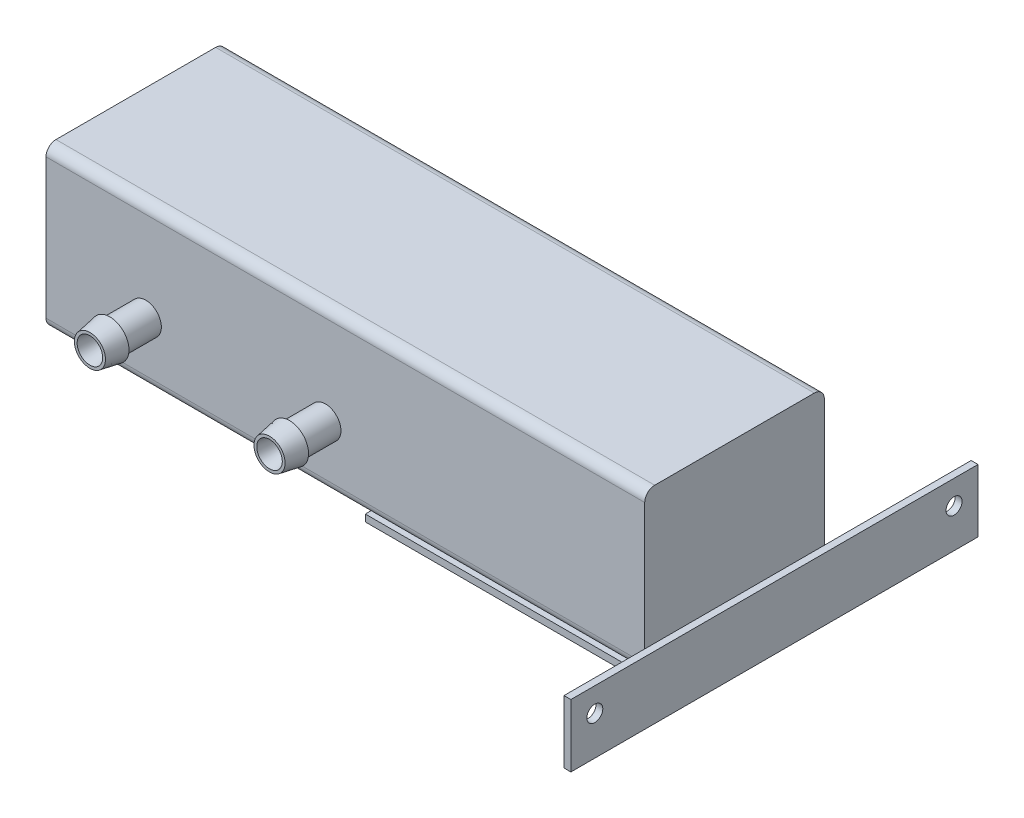
ISO-10303-21;
HEADER;
FILE_DESCRIPTION(('STEP AP214'),'2;1');
FILE_NAME('part.step','',(''),(''),'','','');
FILE_SCHEMA(('AUTOMOTIVE_DESIGN { 1 0 10303 214 1 1 1 1 }'));
ENDSEC;
DATA;
#1=APPLICATION_CONTEXT('core data for automotive mechanical design processes');
#2=APPLICATION_PROTOCOL_DEFINITION('international standard','automotive_design',2000,#1);
#3=PRODUCT_CONTEXT('',#1,'mechanical');
#4=PRODUCT('Part','Part','',(#3));
#5=PRODUCT_RELATED_PRODUCT_CATEGORY('part','',(#4));
#6=PRODUCT_DEFINITION_FORMATION('','',#4);
#7=PRODUCT_DEFINITION_CONTEXT('part definition',#1,'design');
#8=PRODUCT_DEFINITION('design','',#6,#7);
#9=PRODUCT_DEFINITION_SHAPE('','',#8);
#10=(LENGTH_UNIT() NAMED_UNIT(*) SI_UNIT(.MILLI.,.METRE.));
#11=(NAMED_UNIT(*) PLANE_ANGLE_UNIT() SI_UNIT($,.RADIAN.));
#12=(NAMED_UNIT(*) SI_UNIT($,.STERADIAN.) SOLID_ANGLE_UNIT());
#13=UNCERTAINTY_MEASURE_WITH_UNIT(LENGTH_MEASURE(1.E-05),#10,'distance_accuracy_value','');
#14=(GEOMETRIC_REPRESENTATION_CONTEXT(3) GLOBAL_UNCERTAINTY_ASSIGNED_CONTEXT((#13)) GLOBAL_UNIT_ASSIGNED_CONTEXT((#10,
#11,#12)) REPRESENTATION_CONTEXT('',''));
#15=CARTESIAN_POINT('',(0.,0.,0.));
#16=DIRECTION('',(0.,0.,1.));
#17=DIRECTION('',(1.,0.,0.));
#18=AXIS2_PLACEMENT_3D('',#15,#16,#17);
#19=CARTESIAN_POINT('',(0.,0.,28.575));
#20=DIRECTION('',(0.,0.,1.));
#21=DIRECTION('',(1.,0.,0.));
#22=AXIS2_PLACEMENT_3D('',#19,#20,#21);
#23=PLANE('',#22);
#24=DIRECTION('',(1.,0.,0.));
#25=VECTOR('',#24,1.);
#26=CARTESIAN_POINT('',(6.35000000000001,-27.5886003167765,28.575));
#27=LINE('',#26,#25);
#28=CARTESIAN_POINT('',(6.35000000000001,-27.5886003167765,28.575));
#29=VERTEX_POINT('',#28);
#30=CARTESIAN_POINT('',(105.761399683223,-27.5886003167765,28.575));
#31=VERTEX_POINT('',#30);
#32=EDGE_CURVE('E64',#29,#31,#27,.T.);
#33=ORIENTED_EDGE('',*,*,#32,.T.);
#34=DIRECTION('',(0.,1.,0.));
#35=VECTOR('',#34,1.);
#36=CARTESIAN_POINT('',(105.761399683223,0.,28.575));
#37=LINE('',#36,#35);
#38=CARTESIAN_POINT('',(105.761399683223,-25.4,28.575));
#39=VERTEX_POINT('',#38);
#40=EDGE_CURVE('E161',#31,#39,#37,.T.);
#41=ORIENTED_EDGE('',*,*,#40,.T.);
#42=DIRECTION('',(-1.,0.,0.));
#43=VECTOR('',#42,1.);
#44=CARTESIAN_POINT('',(6.35000000000001,-25.4,28.575));
#45=LINE('',#44,#43);
#46=CARTESIAN_POINT('',(6.35000000000001,-25.4,28.575));
#47=VERTEX_POINT('',#46);
#48=EDGE_CURVE('E170',#39,#47,#45,.T.);
#49=ORIENTED_EDGE('',*,*,#48,.T.);
#50=DIRECTION('',(0.,-1.,0.));
#51=VECTOR('',#50,1.);
#52=CARTESIAN_POINT('',(6.35000000000001,-25.4,28.575));
#53=LINE('',#52,#51);
#54=EDGE_CURVE('E163',#47,#29,#53,.T.);
#55=ORIENTED_EDGE('',*,*,#54,.T.);
#56=EDGE_LOOP('',(#33,#41,#49,#55));
#57=FACE_BOUND('',#56,.T.);
#58=ADVANCED_FACE('F49',(#57),#23,.T.);
#59=CARTESIAN_POINT('',(0.,0.,-28.575));
#60=DIRECTION('',(0.,0.,1.));
#61=DIRECTION('',(1.,0.,0.));
#62=AXIS2_PLACEMENT_3D('',#59,#60,#61);
#63=PLANE('',#62);
#64=DIRECTION('',(0.,1.,0.));
#65=VECTOR('',#64,1.);
#66=CARTESIAN_POINT('',(105.761399683223,0.,-28.575));
#67=LINE('',#66,#65);
#68=CARTESIAN_POINT('',(105.761399683223,-27.5886003167765,-28.575));
#69=VERTEX_POINT('',#68);
#70=CARTESIAN_POINT('',(105.761399683223,-25.4,-28.575));
#71=VERTEX_POINT('',#70);
#72=EDGE_CURVE('E12',#69,#71,#67,.T.);
#73=ORIENTED_EDGE('',*,*,#72,.F.);
#74=DIRECTION('',(-1.,0.,0.));
#75=VECTOR('',#74,1.);
#76=CARTESIAN_POINT('',(6.35000000000001,-27.5886003167765,-28.575));
#77=LINE('',#76,#75);
#78=CARTESIAN_POINT('',(6.35000000000001,-27.5886003167765,-28.575));
#79=VERTEX_POINT('',#78);
#80=EDGE_CURVE('E57',#69,#79,#77,.T.);
#81=ORIENTED_EDGE('',*,*,#80,.T.);
#82=DIRECTION('',(0.,1.,0.));
#83=VECTOR('',#82,1.);
#84=CARTESIAN_POINT('',(6.35000000000001,-25.4,-28.575));
#85=LINE('',#84,#83);
#86=CARTESIAN_POINT('',(6.35000000000001,-25.4,-28.575));
#87=VERTEX_POINT('',#86);
#88=EDGE_CURVE('E165',#79,#87,#85,.T.);
#89=ORIENTED_EDGE('',*,*,#88,.T.);
#90=DIRECTION('',(1.,0.,0.));
#91=VECTOR('',#90,1.);
#92=CARTESIAN_POINT('',(6.35000000000001,-25.4,-28.575));
#93=LINE('',#92,#91);
#94=EDGE_CURVE('E73',#87,#71,#93,.T.);
#95=ORIENTED_EDGE('',*,*,#94,.T.);
#96=EDGE_LOOP('',(#73,#81,#89,#95));
#97=FACE_BOUND('',#96,.T.);
#98=ADVANCED_FACE('F181',(#97),#63,.F.);
#99=CARTESIAN_POINT('',(6.35000000000001,-25.4,-132.118734714425));
#100=DIRECTION('',(-1.,0.,0.));
#101=DIRECTION('',(0.,0.,1.));
#102=AXIS2_PLACEMENT_3D('',#99,#100,#101);
#103=PLANE('',#102);
#104=ORIENTED_EDGE('',*,*,#88,.F.);
#105=DIRECTION('',(0.,0.,1.));
#106=VECTOR('',#105,1.);
#107=CARTESIAN_POINT('',(6.35000000000001,-27.5886003167765,-132.118734714425));
#108=LINE('',#107,#106);
#109=EDGE_CURVE('E173',#79,#29,#108,.T.);
#110=ORIENTED_EDGE('',*,*,#109,.T.);
#111=ORIENTED_EDGE('',*,*,#54,.F.);
#112=DIRECTION('',(0.,0.,1.));
#113=VECTOR('',#112,1.);
#114=CARTESIAN_POINT('',(6.35000000000001,-25.4,-132.118734714425));
#115=LINE('',#114,#113);
#116=EDGE_CURVE('E166',#87,#47,#115,.T.);
#117=ORIENTED_EDGE('',*,*,#116,.F.);
#118=EDGE_LOOP('',(#104,#110,#111,#117));
#119=FACE_BOUND('',#118,.T.);
#120=ADVANCED_FACE('F51',(#119),#103,.T.);
#121=CARTESIAN_POINT('',(6.35000000000001,-25.4,-132.118734714425));
#122=DIRECTION('',(0.,1.,0.));
#123=DIRECTION('',(0.,0.,1.));
#124=AXIS2_PLACEMENT_3D('',#121,#122,#123);
#125=PLANE('',#124);
#126=ORIENTED_EDGE('',*,*,#94,.F.);
#127=ORIENTED_EDGE('',*,*,#116,.T.);
#128=ORIENTED_EDGE('',*,*,#48,.F.);
#129=DIRECTION('',(0.,0.,1.));
#130=VECTOR('',#129,1.);
#131=CARTESIAN_POINT('',(105.761399683223,-25.4,-132.118734714425));
#132=LINE('',#131,#130);
#133=EDGE_CURVE('E175',#71,#39,#132,.T.);
#134=ORIENTED_EDGE('',*,*,#133,.F.);
#135=EDGE_LOOP('',(#126,#127,#128,#134));
#136=FACE_BOUND('',#135,.T.);
#137=ADVANCED_FACE('F192',(#136),#125,.T.);
#138=CARTESIAN_POINT('',(105.761399683223,-7.62000000000002,-132.118734714425));
#139=DIRECTION('',(-1.,0.,0.));
#140=DIRECTION('',(0.,0.,1.));
#141=AXIS2_PLACEMENT_3D('',#138,#139,#140);
#142=PLANE('',#141);
#143=CARTESIAN_POINT('',(105.761399683223,-15.24,57.15));
#144=DIRECTION('',(-1.,0.,0.));
#145=DIRECTION('',(0.,0.,1.));
#146=AXIS2_PLACEMENT_3D('',#143,#144,#145);
#147=CIRCLE('',#146,2.54);
#148=CARTESIAN_POINT('',(105.761399683223,-15.24,59.69));
#149=VERTEX_POINT('',#148);
#150=EDGE_CURVE('E232',#149,#149,#147,.T.);
#151=ORIENTED_EDGE('',*,*,#150,.F.);
#152=EDGE_LOOP('',(#151));
#153=FACE_BOUND('',#152,.T.);
#154=CARTESIAN_POINT('',(105.761399683223,-15.24,-57.15));
#155=DIRECTION('',(-1.,0.,0.));
#156=DIRECTION('',(0.,0.,1.));
#157=AXIS2_PLACEMENT_3D('',#154,#155,#156);
#158=CIRCLE('',#157,2.54);
#159=CARTESIAN_POINT('',(105.761399683223,-15.24,-54.61));
#160=VERTEX_POINT('',#159);
#161=EDGE_CURVE('E146',#160,#160,#158,.T.);
#162=ORIENTED_EDGE('',*,*,#161,.F.);
#163=EDGE_LOOP('',(#162));
#164=FACE_BOUND('',#163,.T.);
#165=DIRECTION('',(0.,0.,1.));
#166=VECTOR('',#165,1.);
#167=CARTESIAN_POINT('',(105.761399683223,-7.62000000000002,-132.118734714425));
#168=LINE('',#167,#166);
#169=CARTESIAN_POINT('',(105.761399683223,-7.62000000000002,-64.77));
#170=VERTEX_POINT('',#169);
#171=CARTESIAN_POINT('',(105.761399683223,-7.62000000000002,64.77));
#172=VERTEX_POINT('',#171);
#173=EDGE_CURVE('E126',#170,#172,#168,.T.);
#174=ORIENTED_EDGE('',*,*,#173,.F.);
#175=DIRECTION('',(0.,-1.,0.));
#176=VECTOR('',#175,1.);
#177=CARTESIAN_POINT('',(105.761399683223,-27.5886003167765,-64.77));
#178=LINE('',#177,#176);
#179=CARTESIAN_POINT('',(105.761399683223,-27.5886003167765,-64.77));
#180=VERTEX_POINT('',#179);
#181=EDGE_CURVE('E143',#170,#180,#178,.T.);
#182=ORIENTED_EDGE('',*,*,#181,.T.);
#183=DIRECTION('',(0.,0.,-1.));
#184=VECTOR('',#183,1.);
#185=CARTESIAN_POINT('',(105.761399683223,-27.5886003167765,64.77));
#186=LINE('',#185,#184);
#187=EDGE_CURVE('E151',#69,#180,#186,.T.);
#188=ORIENTED_EDGE('',*,*,#187,.F.);
#189=ORIENTED_EDGE('',*,*,#72,.T.);
#190=ORIENTED_EDGE('',*,*,#133,.T.);
#191=ORIENTED_EDGE('',*,*,#40,.F.);
#192=CARTESIAN_POINT('',(105.761399683223,-27.5886003167765,64.77));
#193=VERTEX_POINT('',#192);
#194=EDGE_CURVE('E158',#193,#31,#186,.T.);
#195=ORIENTED_EDGE('',*,*,#194,.F.);
#196=DIRECTION('',(0.,-1.,0.));
#197=VECTOR('',#196,1.);
#198=CARTESIAN_POINT('',(105.761399683223,-27.5886003167765,64.77));
#199=LINE('',#198,#197);
#200=EDGE_CURVE('E134',#172,#193,#199,.T.);
#201=ORIENTED_EDGE('',*,*,#200,.F.);
#202=EDGE_LOOP('',(#174,#182,#188,#189,#190,#191,#195,#201));
#203=FACE_BOUND('',#202,.T.);
#204=ADVANCED_FACE('F194',(#153,#164,#203),#142,.T.);
#205=CARTESIAN_POINT('',(107.95,-7.62000000000002,-132.118734714425));
#206=DIRECTION('',(0.,1.,0.));
#207=DIRECTION('',(0.,0.,1.));
#208=AXIS2_PLACEMENT_3D('',#205,#206,#207);
#209=PLANE('',#208);
#210=DIRECTION('',(0.,0.,1.));
#211=VECTOR('',#210,1.);
#212=CARTESIAN_POINT('',(107.95,-7.62000000000002,-132.118734714425));
#213=LINE('',#212,#211);
#214=CARTESIAN_POINT('',(107.95,-7.62000000000002,-64.77));
#215=VERTEX_POINT('',#214);
#216=CARTESIAN_POINT('',(107.95,-7.62000000000002,64.77));
#217=VERTEX_POINT('',#216);
#218=EDGE_CURVE('E116',#215,#217,#213,.T.);
#219=ORIENTED_EDGE('',*,*,#218,.F.);
#220=DIRECTION('',(-1.,0.,0.));
#221=VECTOR('',#220,1.);
#222=CARTESIAN_POINT('',(107.95,-7.62000000000002,-64.77));
#223=LINE('',#222,#221);
#224=EDGE_CURVE('E153',#215,#170,#223,.T.);
#225=ORIENTED_EDGE('',*,*,#224,.T.);
#226=ORIENTED_EDGE('',*,*,#173,.T.);
#227=DIRECTION('',(-1.,0.,0.));
#228=VECTOR('',#227,1.);
#229=CARTESIAN_POINT('',(107.95,-7.62000000000002,64.77));
#230=LINE('',#229,#228);
#231=EDGE_CURVE('E130',#217,#172,#230,.T.);
#232=ORIENTED_EDGE('',*,*,#231,.F.);
#233=EDGE_LOOP('',(#219,#225,#226,#232));
#234=FACE_BOUND('',#233,.T.);
#235=ADVANCED_FACE('F131',(#234),#209,.T.);
#236=CARTESIAN_POINT('',(107.95,-25.4,-132.118734714425));
#237=DIRECTION('',(1.,0.,0.));
#238=DIRECTION('',(0.,0.,-1.));
#239=AXIS2_PLACEMENT_3D('',#236,#237,#238);
#240=PLANE('',#239);
#241=CARTESIAN_POINT('',(107.95,-15.24,57.15));
#242=DIRECTION('',(-1.,0.,0.));
#243=DIRECTION('',(0.,0.,1.));
#244=AXIS2_PLACEMENT_3D('',#241,#242,#243);
#245=CIRCLE('',#244,2.54);
#246=CARTESIAN_POINT('',(107.95,-15.24,59.69));
#247=VERTEX_POINT('',#246);
#248=EDGE_CURVE('E154',#247,#247,#245,.T.);
#249=ORIENTED_EDGE('',*,*,#248,.T.);
#250=EDGE_LOOP('',(#249));
#251=FACE_BOUND('',#250,.T.);
#252=CARTESIAN_POINT('',(107.95,-15.24,-57.15));
#253=DIRECTION('',(-1.,0.,0.));
#254=DIRECTION('',(0.,0.,1.));
#255=AXIS2_PLACEMENT_3D('',#252,#253,#254);
#256=CIRCLE('',#255,2.54);
#257=CARTESIAN_POINT('',(107.95,-15.24,-54.61));
#258=VERTEX_POINT('',#257);
#259=EDGE_CURVE('E230',#258,#258,#256,.T.);
#260=ORIENTED_EDGE('',*,*,#259,.T.);
#261=EDGE_LOOP('',(#260));
#262=FACE_BOUND('',#261,.T.);
#263=DIRECTION('',(0.,0.,1.));
#264=VECTOR('',#263,1.);
#265=CARTESIAN_POINT('',(107.95,-27.5886003167765,-132.118734714425));
#266=LINE('',#265,#264);
#267=CARTESIAN_POINT('',(107.95,-27.5886003167765,-64.77));
#268=VERTEX_POINT('',#267);
#269=CARTESIAN_POINT('',(107.95,-27.5886003167765,64.77));
#270=VERTEX_POINT('',#269);
#271=EDGE_CURVE('E127',#268,#270,#266,.T.);
#272=ORIENTED_EDGE('',*,*,#271,.F.);
#273=DIRECTION('',(0.,1.,0.));
#274=VECTOR('',#273,1.);
#275=CARTESIAN_POINT('',(107.95,-27.5886003167765,-64.77));
#276=LINE('',#275,#274);
#277=EDGE_CURVE('E122',#268,#215,#276,.T.);
#278=ORIENTED_EDGE('',*,*,#277,.T.);
#279=ORIENTED_EDGE('',*,*,#218,.T.);
#280=DIRECTION('',(0.,1.,0.));
#281=VECTOR('',#280,1.);
#282=CARTESIAN_POINT('',(107.95,-27.5886003167765,64.77));
#283=LINE('',#282,#281);
#284=EDGE_CURVE('E120',#270,#217,#283,.T.);
#285=ORIENTED_EDGE('',*,*,#284,.F.);
#286=EDGE_LOOP('',(#272,#278,#279,#285));
#287=FACE_BOUND('',#286,.T.);
#288=ADVANCED_FACE('F118',(#251,#262,#287),#240,.T.);
#289=CARTESIAN_POINT('',(6.35000000000001,-27.5886003167765,-132.118734714425));
#290=DIRECTION('',(0.,-1.,0.));
#291=DIRECTION('',(0.,0.,-1.));
#292=AXIS2_PLACEMENT_3D('',#289,#290,#291);
#293=PLANE('',#292);
#294=ORIENTED_EDGE('',*,*,#194,.T.);
#295=ORIENTED_EDGE('',*,*,#32,.F.);
#296=ORIENTED_EDGE('',*,*,#109,.F.);
#297=ORIENTED_EDGE('',*,*,#80,.F.);
#298=ORIENTED_EDGE('',*,*,#187,.T.);
#299=DIRECTION('',(1.,0.,0.));
#300=VECTOR('',#299,1.);
#301=CARTESIAN_POINT('',(107.95,-27.5886003167765,-64.77));
#302=LINE('',#301,#300);
#303=EDGE_CURVE('E140',#180,#268,#302,.T.);
#304=ORIENTED_EDGE('',*,*,#303,.T.);
#305=ORIENTED_EDGE('',*,*,#271,.T.);
#306=DIRECTION('',(1.,0.,0.));
#307=VECTOR('',#306,1.);
#308=CARTESIAN_POINT('',(107.95,-27.5886003167765,64.77));
#309=LINE('',#308,#307);
#310=EDGE_CURVE('E139',#193,#270,#309,.T.);
#311=ORIENTED_EDGE('',*,*,#310,.F.);
#312=EDGE_LOOP('',(#294,#295,#296,#297,#298,#304,#305,#311));
#313=FACE_BOUND('',#312,.T.);
#314=ADVANCED_FACE('F188',(#313),#293,.T.);
#315=CARTESIAN_POINT('',(0.,0.,-64.77));
#316=DIRECTION('',(0.,0.,1.));
#317=DIRECTION('',(1.,0.,0.));
#318=AXIS2_PLACEMENT_3D('',#315,#316,#317);
#319=PLANE('',#318);
#320=ORIENTED_EDGE('',*,*,#277,.F.);
#321=ORIENTED_EDGE('',*,*,#303,.F.);
#322=ORIENTED_EDGE('',*,*,#181,.F.);
#323=ORIENTED_EDGE('',*,*,#224,.F.);
#324=EDGE_LOOP('',(#320,#321,#322,#323));
#325=FACE_BOUND('',#324,.T.);
#326=ADVANCED_FACE('F198',(#325),#319,.F.);
#327=CARTESIAN_POINT('',(0.,0.,64.77));
#328=DIRECTION('',(0.,0.,1.));
#329=DIRECTION('',(1.,0.,0.));
#330=AXIS2_PLACEMENT_3D('',#327,#328,#329);
#331=PLANE('',#330);
#332=ORIENTED_EDGE('',*,*,#284,.T.);
#333=ORIENTED_EDGE('',*,*,#231,.T.);
#334=ORIENTED_EDGE('',*,*,#200,.T.);
#335=ORIENTED_EDGE('',*,*,#310,.T.);
#336=EDGE_LOOP('',(#332,#333,#334,#335));
#337=FACE_BOUND('',#336,.T.);
#338=ADVANCED_FACE('F137',(#337),#331,.T.);
#339=CARTESIAN_POINT('',(107.95,-15.24,-57.15));
#340=DIRECTION('',(-1.,0.,0.));
#341=DIRECTION('',(0.,0.,1.));
#342=AXIS2_PLACEMENT_3D('',#339,#340,#341);
#343=CYLINDRICAL_SURFACE('',#342,2.54);
#344=ORIENTED_EDGE('',*,*,#259,.F.);
#345=EDGE_LOOP('',(#344));
#346=FACE_BOUND('',#345,.T.);
#347=ORIENTED_EDGE('',*,*,#161,.T.);
#348=EDGE_LOOP('',(#347));
#349=FACE_BOUND('',#348,.T.);
#350=ADVANCED_FACE('F205',(#346,#349),#343,.F.);
#351=CARTESIAN_POINT('',(107.95,-15.24,57.15));
#352=DIRECTION('',(-1.,0.,0.));
#353=DIRECTION('',(0.,0.,1.));
#354=AXIS2_PLACEMENT_3D('',#351,#352,#353);
#355=CYLINDRICAL_SURFACE('',#354,2.54);
#356=ORIENTED_EDGE('',*,*,#248,.F.);
#357=EDGE_LOOP('',(#356));
#358=FACE_BOUND('',#357,.T.);
#359=ORIENTED_EDGE('',*,*,#150,.T.);
#360=EDGE_LOOP('',(#359));
#361=FACE_BOUND('',#360,.T.);
#362=ADVANCED_FACE('F241',(#358,#361),#355,.F.);
#363=CLOSED_SHELL('',(#58,#98,#120,#137,#204,#235,#288,#314,#326,#338,#350,#362));
#364=MANIFOLD_SOLID_BREP('B2',#363);
#365=CARTESIAN_POINT('',(-6.34999999999999,-6.34999999999999,46.355));
#366=DIRECTION('',(0.,0.,-1.));
#367=DIRECTION('',(-1.,0.,0.));
#368=AXIS2_PLACEMENT_3D('',#365,#366,#367);
#369=CYLINDRICAL_SURFACE('',#368,4.95300000000002);
#370=CARTESIAN_POINT('',(-6.34999999999999,-6.34999999999999,28.575));
#371=DIRECTION('',(0.,0.,1.));
#372=DIRECTION('',(1.,0.,0.));
#373=AXIS2_PLACEMENT_3D('',#370,#371,#372);
#374=CIRCLE('',#373,4.95300000000002);
#375=CARTESIAN_POINT('',(-1.39699999999998,-6.34999999999999,28.575));
#376=VERTEX_POINT('',#375);
#377=EDGE_CURVE('E781',#376,#376,#374,.T.);
#378=ORIENTED_EDGE('',*,*,#377,.T.);
#379=EDGE_LOOP('',(#378));
#380=FACE_BOUND('',#379,.T.);
#381=CARTESIAN_POINT('',(-6.34999999999999,-6.34999999999999,40.005));
#382=DIRECTION('',(0.,0.,1.));
#383=DIRECTION('',(1.,0.,0.));
#384=AXIS2_PLACEMENT_3D('',#381,#382,#383);
#385=CIRCLE('',#384,4.95300000000002);
#386=CARTESIAN_POINT('',(-1.39699999999998,-6.34999999999999,40.005));
#387=VERTEX_POINT('',#386);
#388=EDGE_CURVE('E417',#387,#387,#385,.T.);
#389=ORIENTED_EDGE('',*,*,#388,.F.);
#390=EDGE_LOOP('',(#389));
#391=FACE_BOUND('',#390,.T.);
#392=ADVANCED_FACE('F333',(#380,#391),#369,.T.);
#393=CARTESIAN_POINT('',(-63.5,-6.34999999999999,46.355));
#394=DIRECTION('',(0.,0.,-1.));
#395=DIRECTION('',(-1.,0.,0.));
#396=AXIS2_PLACEMENT_3D('',#393,#394,#395);
#397=CYLINDRICAL_SURFACE('',#396,4.953);
#398=CARTESIAN_POINT('',(-63.5,-6.34999999999999,28.575));
#399=DIRECTION('',(0.,0.,1.));
#400=DIRECTION('',(1.,0.,0.));
#401=AXIS2_PLACEMENT_3D('',#398,#399,#400);
#402=CIRCLE('',#401,4.953);
#403=CARTESIAN_POINT('',(-58.547,-6.34999999999999,28.575));
#404=VERTEX_POINT('',#403);
#405=EDGE_CURVE('E434',#404,#404,#402,.T.);
#406=ORIENTED_EDGE('',*,*,#405,.T.);
#407=EDGE_LOOP('',(#406));
#408=FACE_BOUND('',#407,.T.);
#409=CARTESIAN_POINT('',(-63.5,-6.34999999999999,40.005));
#410=DIRECTION('',(0.,0.,1.));
#411=DIRECTION('',(1.,0.,0.));
#412=AXIS2_PLACEMENT_3D('',#409,#410,#411);
#413=CIRCLE('',#412,4.953);
#414=CARTESIAN_POINT('',(-58.547,-6.34999999999999,40.005));
#415=VERTEX_POINT('',#414);
#416=EDGE_CURVE('E462',#415,#415,#413,.T.);
#417=ORIENTED_EDGE('',*,*,#416,.F.);
#418=EDGE_LOOP('',(#417));
#419=FACE_BOUND('',#418,.T.);
#420=ADVANCED_FACE('F543',(#408,#419),#397,.T.);
#421=CARTESIAN_POINT('',(95.25,25.4,28.575));
#422=DIRECTION('',(-1.,0.,0.));
#423=DIRECTION('',(0.,-1.,0.));
#424=AXIS2_PLACEMENT_3D('',#421,#422,#423);
#425=PLANE('',#424);
#426=DIRECTION('',(0.,0.,-1.));
#427=VECTOR('',#426,1.);
#428=CARTESIAN_POINT('',(95.25,25.4,28.575));
#429=LINE('',#428,#427);
#430=CARTESIAN_POINT('',(95.25,25.4,25.4));
#431=VERTEX_POINT('',#430);
#432=CARTESIAN_POINT('',(95.25,25.4,-25.4));
#433=VERTEX_POINT('',#432);
#434=EDGE_CURVE('E450',#431,#433,#429,.T.);
#435=ORIENTED_EDGE('',*,*,#434,.F.);
#436=CARTESIAN_POINT('',(95.25,22.225,25.4));
#437=DIRECTION('',(-1.,0.,0.));
#438=DIRECTION('',(0.,-1.,0.));
#439=AXIS2_PLACEMENT_3D('',#436,#437,#438);
#440=CIRCLE('',#439,3.175);
#441=CARTESIAN_POINT('',(95.25,22.225,28.575));
#442=VERTEX_POINT('',#441);
#443=EDGE_CURVE('E422',#431,#442,#440,.F.);
#444=ORIENTED_EDGE('',*,*,#443,.T.);
#445=DIRECTION('',(0.,1.,0.));
#446=VECTOR('',#445,1.);
#447=CARTESIAN_POINT('',(95.25,25.4,28.575));
#448=LINE('',#447,#446);
#449=CARTESIAN_POINT('',(95.25,-22.225,28.575));
#450=VERTEX_POINT('',#449);
#451=EDGE_CURVE('E411',#450,#442,#448,.T.);
#452=ORIENTED_EDGE('',*,*,#451,.F.);
#453=CARTESIAN_POINT('',(95.25,-22.225,25.4));
#454=DIRECTION('',(-1.,0.,0.));
#455=DIRECTION('',(0.,-1.,0.));
#456=AXIS2_PLACEMENT_3D('',#453,#454,#455);
#457=CIRCLE('',#456,3.175);
#458=CARTESIAN_POINT('',(95.25,-25.4,25.4));
#459=VERTEX_POINT('',#458);
#460=EDGE_CURVE('E356',#450,#459,#457,.F.);
#461=ORIENTED_EDGE('',*,*,#460,.T.);
#462=DIRECTION('',(0.,0.,-1.));
#463=VECTOR('',#462,1.);
#464=CARTESIAN_POINT('',(95.25,-25.4,28.575));
#465=LINE('',#464,#463);
#466=CARTESIAN_POINT('',(95.25,-25.4,-25.4));
#467=VERTEX_POINT('',#466);
#468=EDGE_CURVE('E428',#459,#467,#465,.T.);
#469=ORIENTED_EDGE('',*,*,#468,.T.);
#470=CARTESIAN_POINT('',(95.25,-22.225,-25.4));
#471=DIRECTION('',(-1.,0.,0.));
#472=DIRECTION('',(0.,-1.,0.));
#473=AXIS2_PLACEMENT_3D('',#470,#471,#472);
#474=CIRCLE('',#473,3.175);
#475=CARTESIAN_POINT('',(95.25,-22.225,-28.575));
#476=VERTEX_POINT('',#475);
#477=EDGE_CURVE('E349',#467,#476,#474,.F.);
#478=ORIENTED_EDGE('',*,*,#477,.T.);
#479=DIRECTION('',(0.,1.,0.));
#480=VECTOR('',#479,1.);
#481=CARTESIAN_POINT('',(95.25,25.4,-28.575));
#482=LINE('',#481,#480);
#483=CARTESIAN_POINT('',(95.25,22.225,-28.575));
#484=VERTEX_POINT('',#483);
#485=EDGE_CURVE('E431',#476,#484,#482,.T.);
#486=ORIENTED_EDGE('',*,*,#485,.T.);
#487=CARTESIAN_POINT('',(95.25,22.225,-25.4));
#488=DIRECTION('',(-1.,0.,0.));
#489=DIRECTION('',(0.,-1.,0.));
#490=AXIS2_PLACEMENT_3D('',#487,#488,#489);
#491=CIRCLE('',#490,3.175);
#492=EDGE_CURVE('E497',#484,#433,#491,.F.);
#493=ORIENTED_EDGE('',*,*,#492,.T.);
#494=EDGE_LOOP('',(#435,#444,#452,#461,#469,#478,#486,#493));
#495=FACE_BOUND('',#494,.T.);
#496=ADVANCED_FACE('F420',(#495),#425,.F.);
#497=CARTESIAN_POINT('',(-95.25,25.4,28.575));
#498=DIRECTION('',(0.,-1.,0.));
#499=DIRECTION('',(0.,0.,-1.));
#500=AXIS2_PLACEMENT_3D('',#497,#498,#499);
#501=PLANE('',#500);
#502=DIRECTION('',(0.,0.,-1.));
#503=VECTOR('',#502,1.);
#504=CARTESIAN_POINT('',(-95.25,25.4,28.575));
#505=LINE('',#504,#503);
#506=CARTESIAN_POINT('',(-95.25,25.4,25.4));
#507=VERTEX_POINT('',#506);
#508=CARTESIAN_POINT('',(-95.25,25.4,-25.4));
#509=VERTEX_POINT('',#508);
#510=EDGE_CURVE('E446',#507,#509,#505,.T.);
#511=ORIENTED_EDGE('',*,*,#510,.F.);
#512=DIRECTION('',(-1.,0.,0.));
#513=VECTOR('',#512,1.);
#514=CARTESIAN_POINT('',(95.25,25.4,25.4));
#515=LINE('',#514,#513);
#516=EDGE_CURVE('E404',#507,#431,#515,.F.);
#517=ORIENTED_EDGE('',*,*,#516,.T.);
#518=ORIENTED_EDGE('',*,*,#434,.T.);
#519=DIRECTION('',(-1.,0.,0.));
#520=VECTOR('',#519,1.);
#521=CARTESIAN_POINT('',(-95.25,25.4,-25.4));
#522=LINE('',#521,#520);
#523=EDGE_CURVE('E489',#433,#509,#522,.T.);
#524=ORIENTED_EDGE('',*,*,#523,.T.);
#525=EDGE_LOOP('',(#511,#517,#518,#524));
#526=FACE_BOUND('',#525,.T.);
#527=ADVANCED_FACE('F526',(#526),#501,.F.);
#528=CARTESIAN_POINT('',(-95.25,25.4,28.575));
#529=DIRECTION('',(1.,0.,0.));
#530=DIRECTION('',(0.,0.,-1.));
#531=AXIS2_PLACEMENT_3D('',#528,#529,#530);
#532=PLANE('',#531);
#533=DIRECTION('',(0.,-1.,0.));
#534=VECTOR('',#533,1.);
#535=CARTESIAN_POINT('',(-95.25,25.4,28.575));
#536=LINE('',#535,#534);
#537=CARTESIAN_POINT('',(-95.25,22.225,28.575));
#538=VERTEX_POINT('',#537);
#539=CARTESIAN_POINT('',(-95.25,-22.225,28.575));
#540=VERTEX_POINT('',#539);
#541=EDGE_CURVE('E414',#538,#540,#536,.T.);
#542=ORIENTED_EDGE('',*,*,#541,.F.);
#543=CARTESIAN_POINT('',(-95.25,22.225,25.4));
#544=DIRECTION('',(1.,0.,0.));
#545=DIRECTION('',(0.,0.,-1.));
#546=AXIS2_PLACEMENT_3D('',#543,#544,#545);
#547=CIRCLE('',#546,3.175);
#548=EDGE_CURVE('E486',#538,#507,#547,.F.);
#549=ORIENTED_EDGE('',*,*,#548,.T.);
#550=ORIENTED_EDGE('',*,*,#510,.T.);
#551=CARTESIAN_POINT('',(-95.25,22.225,-25.4));
#552=DIRECTION('',(1.,0.,0.));
#553=DIRECTION('',(0.,0.,-1.));
#554=AXIS2_PLACEMENT_3D('',#551,#552,#553);
#555=CIRCLE('',#554,3.175);
#556=CARTESIAN_POINT('',(-95.25,22.225,-28.575));
#557=VERTEX_POINT('',#556);
#558=EDGE_CURVE('E483',#509,#557,#555,.F.);
#559=ORIENTED_EDGE('',*,*,#558,.T.);
#560=DIRECTION('',(0.,-1.,0.));
#561=VECTOR('',#560,1.);
#562=CARTESIAN_POINT('',(-95.25,25.4,-28.575));
#563=LINE('',#562,#561);
#564=CARTESIAN_POINT('',(-95.25,-22.225,-28.575));
#565=VERTEX_POINT('',#564);
#566=EDGE_CURVE('E424',#557,#565,#563,.T.);
#567=ORIENTED_EDGE('',*,*,#566,.T.);
#568=CARTESIAN_POINT('',(-95.25,-22.225,-25.4));
#569=DIRECTION('',(1.,0.,0.));
#570=DIRECTION('',(0.,0.,-1.));
#571=AXIS2_PLACEMENT_3D('',#568,#569,#570);
#572=CIRCLE('',#571,3.175);
#573=CARTESIAN_POINT('',(-95.25,-25.4,-25.4));
#574=VERTEX_POINT('',#573);
#575=EDGE_CURVE('E480',#565,#574,#572,.F.);
#576=ORIENTED_EDGE('',*,*,#575,.T.);
#577=DIRECTION('',(0.,0.,-1.));
#578=VECTOR('',#577,1.);
#579=CARTESIAN_POINT('',(-95.25,-25.4,28.575));
#580=LINE('',#579,#578);
#581=CARTESIAN_POINT('',(-95.25,-25.4,25.4));
#582=VERTEX_POINT('',#581);
#583=EDGE_CURVE('E442',#582,#574,#580,.T.);
#584=ORIENTED_EDGE('',*,*,#583,.F.);
#585=CARTESIAN_POINT('',(-95.25,-22.225,25.4));
#586=DIRECTION('',(1.,0.,0.));
#587=DIRECTION('',(0.,0.,-1.));
#588=AXIS2_PLACEMENT_3D('',#585,#586,#587);
#589=CIRCLE('',#588,3.175);
#590=EDGE_CURVE('E477',#582,#540,#589,.F.);
#591=ORIENTED_EDGE('',*,*,#590,.T.);
#592=EDGE_LOOP('',(#542,#549,#550,#559,#567,#576,#584,#591));
#593=FACE_BOUND('',#592,.T.);
#594=ADVANCED_FACE('F512',(#593),#532,.F.);
#595=CARTESIAN_POINT('',(-95.25,-25.4,28.575));
#596=DIRECTION('',(0.,1.,0.));
#597=DIRECTION('',(-1.,0.,0.));
#598=AXIS2_PLACEMENT_3D('',#595,#596,#597);
#599=PLANE('',#598);
#600=ORIENTED_EDGE('',*,*,#583,.T.);
#601=DIRECTION('',(1.,0.,0.));
#602=VECTOR('',#601,1.);
#603=CARTESIAN_POINT('',(-95.25,-25.4,-25.4));
#604=LINE('',#603,#602);
#605=EDGE_CURVE('E47',#574,#467,#604,.T.);
#606=ORIENTED_EDGE('',*,*,#605,.T.);
#607=ORIENTED_EDGE('',*,*,#468,.F.);
#608=DIRECTION('',(1.,0.,0.));
#609=VECTOR('',#608,1.);
#610=CARTESIAN_POINT('',(-95.25,-25.4,25.4));
#611=LINE('',#610,#609);
#612=EDGE_CURVE('E342',#459,#582,#611,.F.);
#613=ORIENTED_EDGE('',*,*,#612,.T.);
#614=EDGE_LOOP('',(#600,#606,#607,#613));
#615=FACE_BOUND('',#614,.T.);
#616=ADVANCED_FACE('F510',(#615),#599,.F.);
#617=CARTESIAN_POINT('',(0.,0.,28.575));
#618=DIRECTION('',(0.,0.,1.));
#619=DIRECTION('',(1.,0.,0.));
#620=AXIS2_PLACEMENT_3D('',#617,#618,#619);
#621=PLANE('',#620);
#622=ORIENTED_EDGE('',*,*,#377,.F.);
#623=EDGE_LOOP('',(#622));
#624=FACE_BOUND('',#623,.T.);
#625=ORIENTED_EDGE('',*,*,#405,.F.);
#626=EDGE_LOOP('',(#625));
#627=FACE_BOUND('',#626,.T.);
#628=ORIENTED_EDGE('',*,*,#451,.T.);
#629=DIRECTION('',(-1.,0.,0.));
#630=VECTOR('',#629,1.);
#631=CARTESIAN_POINT('',(-95.25,22.225,28.575));
#632=LINE('',#631,#630);
#633=EDGE_CURVE('E416',#442,#538,#632,.T.);
#634=ORIENTED_EDGE('',*,*,#633,.T.);
#635=ORIENTED_EDGE('',*,*,#541,.T.);
#636=DIRECTION('',(1.,0.,0.));
#637=VECTOR('',#636,1.);
#638=CARTESIAN_POINT('',(95.25,-22.225,28.575));
#639=LINE('',#638,#637);
#640=EDGE_CURVE('E402',#540,#450,#639,.T.);
#641=ORIENTED_EDGE('',*,*,#640,.T.);
#642=EDGE_LOOP('',(#628,#634,#635,#641));
#643=FACE_BOUND('',#642,.T.);
#644=ADVANCED_FACE('F409',(#624,#627,#643),#621,.T.);
#645=CARTESIAN_POINT('',(0.,0.,-28.575));
#646=DIRECTION('',(0.,0.,1.));
#647=DIRECTION('',(1.,0.,0.));
#648=AXIS2_PLACEMENT_3D('',#645,#646,#647);
#649=PLANE('',#648);
#650=ORIENTED_EDGE('',*,*,#566,.F.);
#651=DIRECTION('',(-1.,0.,0.));
#652=VECTOR('',#651,1.);
#653=CARTESIAN_POINT('',(0.,22.225,-28.575));
#654=LINE('',#653,#652);
#655=EDGE_CURVE('E505',#557,#484,#654,.F.);
#656=ORIENTED_EDGE('',*,*,#655,.T.);
#657=ORIENTED_EDGE('',*,*,#485,.F.);
#658=DIRECTION('',(1.,0.,0.));
#659=VECTOR('',#658,1.);
#660=CARTESIAN_POINT('',(0.,-22.225,-28.575));
#661=LINE('',#660,#659);
#662=EDGE_CURVE('E502',#476,#565,#661,.F.);
#663=ORIENTED_EDGE('',*,*,#662,.T.);
#664=EDGE_LOOP('',(#650,#656,#657,#663));
#665=FACE_BOUND('',#664,.T.);
#666=ADVANCED_FACE('F519',(#665),#649,.F.);
#667=CARTESIAN_POINT('',(-63.5,-6.34999999999999,46.355));
#668=DIRECTION('',(0.,0.,-1.));
#669=DIRECTION('',(1.,0.,0.));
#670=AXIS2_PLACEMENT_3D('',#667,#668,#669);
#671=CONICAL_SURFACE('',#670,4.953,0.174532925199433);
#672=CARTESIAN_POINT('',(-63.5,-6.34999999999999,40.005));
#673=DIRECTION('',(0.,0.,1.));
#674=DIRECTION('',(1.,0.,0.));
#675=AXIS2_PLACEMENT_3D('',#672,#673,#674);
#676=CIRCLE('',#675,6.07267632749875);
#677=CARTESIAN_POINT('',(-57.4273236725013,-6.34999999999999,40.005));
#678=VERTEX_POINT('',#677);
#679=EDGE_CURVE('E468',#678,#678,#676,.T.);
#680=ORIENTED_EDGE('',*,*,#679,.T.);
#681=EDGE_LOOP('',(#680));
#682=FACE_BOUND('',#681,.T.);
#683=CARTESIAN_POINT('',(-63.5,-6.34999999999999,46.355));
#684=DIRECTION('',(0.,0.,1.));
#685=DIRECTION('',(1.,0.,0.));
#686=AXIS2_PLACEMENT_3D('',#683,#684,#685);
#687=CIRCLE('',#686,4.953);
#688=CARTESIAN_POINT('',(-58.547,-6.34999999999999,46.355));
#689=VERTEX_POINT('',#688);
#690=EDGE_CURVE('E807',#689,#689,#687,.T.);
#691=ORIENTED_EDGE('',*,*,#690,.F.);
#692=EDGE_LOOP('',(#691));
#693=FACE_BOUND('',#692,.T.);
#694=ADVANCED_FACE('F573',(#682,#693),#671,.T.);
#695=CARTESIAN_POINT('',(-63.5,-6.34999999999999,40.005));
#696=DIRECTION('',(0.,0.,1.));
#697=DIRECTION('',(1.,0.,0.));
#698=AXIS2_PLACEMENT_3D('',#695,#696,#697);
#699=PLANE('',#698);
#700=ORIENTED_EDGE('',*,*,#416,.T.);
#701=EDGE_LOOP('',(#700));
#702=FACE_BOUND('',#701,.T.);
#703=ORIENTED_EDGE('',*,*,#679,.F.);
#704=EDGE_LOOP('',(#703));
#705=FACE_BOUND('',#704,.T.);
#706=ADVANCED_FACE('F565',(#702,#705),#699,.F.);
#707=CARTESIAN_POINT('',(-63.5,-6.34999999999999,46.355));
#708=DIRECTION('',(0.,0.,1.));
#709=DIRECTION('',(1.,0.,0.));
#710=AXIS2_PLACEMENT_3D('',#707,#708,#709);
#711=PLANE('',#710);
#712=ORIENTED_EDGE('',*,*,#690,.T.);
#713=EDGE_LOOP('',(#712));
#714=FACE_BOUND('',#713,.T.);
#715=CARTESIAN_POINT('',(-63.5,-6.34999999999999,46.355));
#716=DIRECTION('',(0.,0.,1.));
#717=DIRECTION('',(1.,0.,0.));
#718=AXIS2_PLACEMENT_3D('',#715,#716,#717);
#719=CIRCLE('',#718,4.06399999999999);
#720=CARTESIAN_POINT('',(-59.436,-6.34999999999999,46.355));
#721=VERTEX_POINT('',#720);
#722=EDGE_CURVE('E784',#721,#721,#719,.T.);
#723=ORIENTED_EDGE('',*,*,#722,.F.);
#724=EDGE_LOOP('',(#723));
#725=FACE_BOUND('',#724,.T.);
#726=ADVANCED_FACE('F562',(#714,#725),#711,.T.);
#727=CARTESIAN_POINT('',(-63.5,-6.34999999999999,46.355));
#728=DIRECTION('',(0.,0.,1.));
#729=DIRECTION('',(1.,0.,0.));
#730=AXIS2_PLACEMENT_3D('',#727,#728,#729);
#731=CONICAL_SURFACE('',#730,4.06399999999999,0.174532925199433);
#732=CARTESIAN_POINT('',(-63.5,-6.34999999999999,40.005));
#733=DIRECTION('',(0.,0.,1.));
#734=DIRECTION('',(1.,0.,0.));
#735=AXIS2_PLACEMENT_3D('',#732,#733,#734);
#736=CIRCLE('',#735,2.94432367250124);
#737=CARTESIAN_POINT('',(-60.5556763274988,-6.34999999999999,40.005));
#738=VERTEX_POINT('',#737);
#739=EDGE_CURVE('E472',#738,#738,#736,.T.);
#740=ORIENTED_EDGE('',*,*,#739,.F.);
#741=EDGE_LOOP('',(#740));
#742=FACE_BOUND('',#741,.T.);
#743=ORIENTED_EDGE('',*,*,#722,.T.);
#744=EDGE_LOOP('',(#743));
#745=FACE_BOUND('',#744,.T.);
#746=ADVANCED_FACE('F564',(#742,#745),#731,.F.);
#747=ORIENTED_EDGE('',*,*,#739,.T.);
#748=EDGE_LOOP('',(#747));
#749=FACE_BOUND('',#748,.T.);
#750=CARTESIAN_POINT('',(-63.5,-6.34999999999999,40.005));
#751=DIRECTION('',(0.,0.,1.));
#752=DIRECTION('',(1.,0.,0.));
#753=AXIS2_PLACEMENT_3D('',#750,#751,#752);
#754=CIRCLE('',#753,4.06399999999999);
#755=CARTESIAN_POINT('',(-59.436,-6.34999999999999,40.005));
#756=VERTEX_POINT('',#755);
#757=EDGE_CURVE('E463',#756,#756,#754,.T.);
#758=ORIENTED_EDGE('',*,*,#757,.F.);
#759=EDGE_LOOP('',(#758));
#760=FACE_BOUND('',#759,.T.);
#761=ADVANCED_FACE('F668',(#749,#760),#699,.F.);
#762=CARTESIAN_POINT('',(-63.5,-6.34999999999999,28.575));
#763=DIRECTION('',(0.,0.,1.));
#764=DIRECTION('',(1.,0.,0.));
#765=AXIS2_PLACEMENT_3D('',#762,#763,#764);
#766=CIRCLE('',#765,4.06399999999999);
#767=CARTESIAN_POINT('',(-59.436,-6.34999999999999,28.575));
#768=VERTEX_POINT('',#767);
#769=EDGE_CURVE('E454',#768,#768,#766,.F.);
#770=ORIENTED_EDGE('',*,*,#769,.F.);
#771=EDGE_LOOP('',(#770));
#772=FACE_BOUND('',#771,.T.);
#773=ADVANCED_FACE('F560',(#772),#621,.T.);
#774=CARTESIAN_POINT('',(-63.5,-6.34999999999999,46.355));
#775=DIRECTION('',(0.,0.,-1.));
#776=DIRECTION('',(-1.,0.,0.));
#777=AXIS2_PLACEMENT_3D('',#774,#775,#776);
#778=CYLINDRICAL_SURFACE('',#777,4.06399999999999);
#779=ORIENTED_EDGE('',*,*,#769,.T.);
#780=EDGE_LOOP('',(#779));
#781=FACE_BOUND('',#780,.T.);
#782=ORIENTED_EDGE('',*,*,#757,.T.);
#783=EDGE_LOOP('',(#782));
#784=FACE_BOUND('',#783,.T.);
#785=ADVANCED_FACE('F556',(#781,#784),#778,.F.);
#786=CARTESIAN_POINT('',(-6.34999999999999,-6.34999999999999,46.355));
#787=DIRECTION('',(0.,0.,-1.));
#788=DIRECTION('',(1.,0.,0.));
#789=AXIS2_PLACEMENT_3D('',#786,#787,#788);
#790=CONICAL_SURFACE('',#789,4.95300000000002,0.174532925199433);
#791=CARTESIAN_POINT('',(-6.34999999999999,-6.34999999999999,40.005));
#792=DIRECTION('',(0.,0.,1.));
#793=DIRECTION('',(1.,0.,0.));
#794=AXIS2_PLACEMENT_3D('',#791,#792,#793);
#795=CIRCLE('',#794,6.07267632749877);
#796=CARTESIAN_POINT('',(-0.277323672501223,-6.34999999999999,40.005));
#797=VERTEX_POINT('',#796);
#798=EDGE_CURVE('E473',#797,#797,#795,.T.);
#799=ORIENTED_EDGE('',*,*,#798,.T.);
#800=EDGE_LOOP('',(#799));
#801=FACE_BOUND('',#800,.T.);
#802=CARTESIAN_POINT('',(-6.34999999999999,-6.34999999999999,46.355));
#803=DIRECTION('',(0.,0.,1.));
#804=DIRECTION('',(1.,0.,0.));
#805=AXIS2_PLACEMENT_3D('',#802,#803,#804);
#806=CIRCLE('',#805,4.95300000000002);
#807=CARTESIAN_POINT('',(-1.39699999999998,-6.34999999999999,46.355));
#808=VERTEX_POINT('',#807);
#809=EDGE_CURVE('E776',#808,#808,#806,.T.);
#810=ORIENTED_EDGE('',*,*,#809,.F.);
#811=EDGE_LOOP('',(#810));
#812=FACE_BOUND('',#811,.T.);
#813=ADVANCED_FACE('F559',(#801,#812),#790,.T.);
#814=CARTESIAN_POINT('',(-6.34999999999999,-6.34999999999999,40.005));
#815=DIRECTION('',(0.,0.,1.));
#816=DIRECTION('',(1.,0.,0.));
#817=AXIS2_PLACEMENT_3D('',#814,#815,#816);
#818=PLANE('',#817);
#819=ORIENTED_EDGE('',*,*,#388,.T.);
#820=EDGE_LOOP('',(#819));
#821=FACE_BOUND('',#820,.T.);
#822=ORIENTED_EDGE('',*,*,#798,.F.);
#823=EDGE_LOOP('',(#822));
#824=FACE_BOUND('',#823,.T.);
#825=ADVANCED_FACE('F642',(#821,#824),#818,.F.);
#826=CARTESIAN_POINT('',(-6.34999999999999,-6.34999999999999,46.355));
#827=DIRECTION('',(0.,0.,1.));
#828=DIRECTION('',(1.,0.,0.));
#829=AXIS2_PLACEMENT_3D('',#826,#827,#828);
#830=PLANE('',#829);
#831=ORIENTED_EDGE('',*,*,#809,.T.);
#832=EDGE_LOOP('',(#831));
#833=FACE_BOUND('',#832,.T.);
#834=CARTESIAN_POINT('',(-6.34999999999999,-6.34999999999999,46.355));
#835=DIRECTION('',(0.,0.,1.));
#836=DIRECTION('',(1.,0.,0.));
#837=AXIS2_PLACEMENT_3D('',#834,#835,#836);
#838=CIRCLE('',#837,4.06400000000001);
#839=CARTESIAN_POINT('',(-2.28599999999998,-6.34999999999999,46.355));
#840=VERTEX_POINT('',#839);
#841=EDGE_CURVE('E467',#840,#840,#838,.T.);
#842=ORIENTED_EDGE('',*,*,#841,.F.);
#843=EDGE_LOOP('',(#842));
#844=FACE_BOUND('',#843,.T.);
#845=ADVANCED_FACE('F555',(#833,#844),#830,.T.);
#846=CARTESIAN_POINT('',(-6.34999999999999,-6.34999999999999,46.355));
#847=DIRECTION('',(0.,0.,1.));
#848=DIRECTION('',(1.,0.,0.));
#849=AXIS2_PLACEMENT_3D('',#846,#847,#848);
#850=CONICAL_SURFACE('',#849,4.06400000000001,0.174532925199433);
#851=CARTESIAN_POINT('',(-6.34999999999999,-6.34999999999999,40.005));
#852=DIRECTION('',(0.,0.,1.));
#853=DIRECTION('',(1.,0.,0.));
#854=AXIS2_PLACEMENT_3D('',#851,#852,#853);
#855=CIRCLE('',#854,2.94432367250125);
#856=CARTESIAN_POINT('',(-3.40567632749874,-6.34999999999999,40.005));
#857=VERTEX_POINT('',#856);
#858=EDGE_CURVE('E824',#857,#857,#855,.T.);
#859=ORIENTED_EDGE('',*,*,#858,.F.);
#860=EDGE_LOOP('',(#859));
#861=FACE_BOUND('',#860,.T.);
#862=ORIENTED_EDGE('',*,*,#841,.T.);
#863=EDGE_LOOP('',(#862));
#864=FACE_BOUND('',#863,.T.);
#865=ADVANCED_FACE('F639',(#861,#864),#850,.F.);
#866=ORIENTED_EDGE('',*,*,#858,.T.);
#867=EDGE_LOOP('',(#866));
#868=FACE_BOUND('',#867,.T.);
#869=CARTESIAN_POINT('',(-6.34999999999999,-6.34999999999999,40.005));
#870=DIRECTION('',(0.,0.,1.));
#871=DIRECTION('',(1.,0.,0.));
#872=AXIS2_PLACEMENT_3D('',#869,#870,#871);
#873=CIRCLE('',#872,4.06400000000001);
#874=CARTESIAN_POINT('',(-2.28599999999998,-6.34999999999999,40.005));
#875=VERTEX_POINT('',#874);
#876=EDGE_CURVE('E469',#875,#875,#873,.T.);
#877=ORIENTED_EDGE('',*,*,#876,.F.);
#878=EDGE_LOOP('',(#877));
#879=FACE_BOUND('',#878,.T.);
#880=ADVANCED_FACE('F634',(#868,#879),#818,.F.);
#881=CARTESIAN_POINT('',(-6.34999999999999,-6.34999999999999,28.575));
#882=DIRECTION('',(0.,0.,1.));
#883=DIRECTION('',(1.,0.,0.));
#884=AXIS2_PLACEMENT_3D('',#881,#882,#883);
#885=CIRCLE('',#884,4.06400000000001);
#886=CARTESIAN_POINT('',(-2.28599999999998,-6.34999999999999,28.575));
#887=VERTEX_POINT('',#886);
#888=EDGE_CURVE('E458',#887,#887,#885,.F.);
#889=ORIENTED_EDGE('',*,*,#888,.F.);
#890=EDGE_LOOP('',(#889));
#891=FACE_BOUND('',#890,.T.);
#892=ADVANCED_FACE('F538',(#891),#621,.T.);
#893=CARTESIAN_POINT('',(-6.34999999999999,-6.34999999999999,46.355));
#894=DIRECTION('',(0.,0.,-1.));
#895=DIRECTION('',(-1.,0.,0.));
#896=AXIS2_PLACEMENT_3D('',#893,#894,#895);
#897=CYLINDRICAL_SURFACE('',#896,4.06400000000001);
#898=ORIENTED_EDGE('',*,*,#888,.T.);
#899=EDGE_LOOP('',(#898));
#900=FACE_BOUND('',#899,.T.);
#901=ORIENTED_EDGE('',*,*,#876,.T.);
#902=EDGE_LOOP('',(#901));
#903=FACE_BOUND('',#902,.T.);
#904=ADVANCED_FACE('F531',(#900,#903),#897,.F.);
#905=CARTESIAN_POINT('',(0.,22.225,25.4));
#906=DIRECTION('',(1.,0.,0.));
#907=DIRECTION('',(0.,0.,-1.));
#908=AXIS2_PLACEMENT_3D('',#905,#906,#907);
#909=CYLINDRICAL_SURFACE('',#908,3.175);
#910=ORIENTED_EDGE('',*,*,#443,.F.);
#911=ORIENTED_EDGE('',*,*,#516,.F.);
#912=ORIENTED_EDGE('',*,*,#548,.F.);
#913=ORIENTED_EDGE('',*,*,#633,.F.);
#914=EDGE_LOOP('',(#910,#911,#912,#913));
#915=FACE_BOUND('',#914,.T.);
#916=ADVANCED_FACE('F529',(#915),#909,.T.);
#917=CARTESIAN_POINT('',(-95.25,22.225,-25.4));
#918=DIRECTION('',(-1.,0.,0.));
#919=DIRECTION('',(0.,0.,1.));
#920=AXIS2_PLACEMENT_3D('',#917,#918,#919);
#921=CYLINDRICAL_SURFACE('',#920,3.175);
#922=ORIENTED_EDGE('',*,*,#492,.F.);
#923=ORIENTED_EDGE('',*,*,#655,.F.);
#924=ORIENTED_EDGE('',*,*,#558,.F.);
#925=ORIENTED_EDGE('',*,*,#523,.F.);
#926=EDGE_LOOP('',(#922,#923,#924,#925));
#927=FACE_BOUND('',#926,.T.);
#928=ADVANCED_FACE('F522',(#927),#921,.T.);
#929=CARTESIAN_POINT('',(-95.25,-22.225,-25.4));
#930=DIRECTION('',(1.,0.,0.));
#931=DIRECTION('',(0.,1.,0.));
#932=AXIS2_PLACEMENT_3D('',#929,#930,#931);
#933=CYLINDRICAL_SURFACE('',#932,3.175);
#934=ORIENTED_EDGE('',*,*,#575,.F.);
#935=ORIENTED_EDGE('',*,*,#662,.F.);
#936=ORIENTED_EDGE('',*,*,#477,.F.);
#937=ORIENTED_EDGE('',*,*,#605,.F.);
#938=EDGE_LOOP('',(#934,#935,#936,#937));
#939=FACE_BOUND('',#938,.T.);
#940=ADVANCED_FACE('F515',(#939),#933,.T.);
#941=CARTESIAN_POINT('',(0.,-22.225,25.4));
#942=DIRECTION('',(-1.,0.,0.));
#943=DIRECTION('',(0.,-1.,0.));
#944=AXIS2_PLACEMENT_3D('',#941,#942,#943);
#945=CYLINDRICAL_SURFACE('',#944,3.175);
#946=ORIENTED_EDGE('',*,*,#590,.F.);
#947=ORIENTED_EDGE('',*,*,#612,.F.);
#948=ORIENTED_EDGE('',*,*,#460,.F.);
#949=ORIENTED_EDGE('',*,*,#640,.F.);
#950=EDGE_LOOP('',(#946,#947,#948,#949));
#951=FACE_BOUND('',#950,.T.);
#952=ADVANCED_FACE('F335',(#951),#945,.T.);
#953=CLOSED_SHELL('',(#392,#420,#496,#527,#594,#616,#644,#666,#694,#706,#726,#746,#761,#773,
#785,#813,#825,#845,#865,#880,#892,#904,#916,#928,#940,#952));
#954=MANIFOLD_SOLID_BREP('B6',#953);
#955=ADVANCED_BREP_SHAPE_REPRESENTATION('',(#18,#364,#954),#14);
#956=SHAPE_DEFINITION_REPRESENTATION(#9,#955);
ENDSEC;
END-ISO-10303-21;
